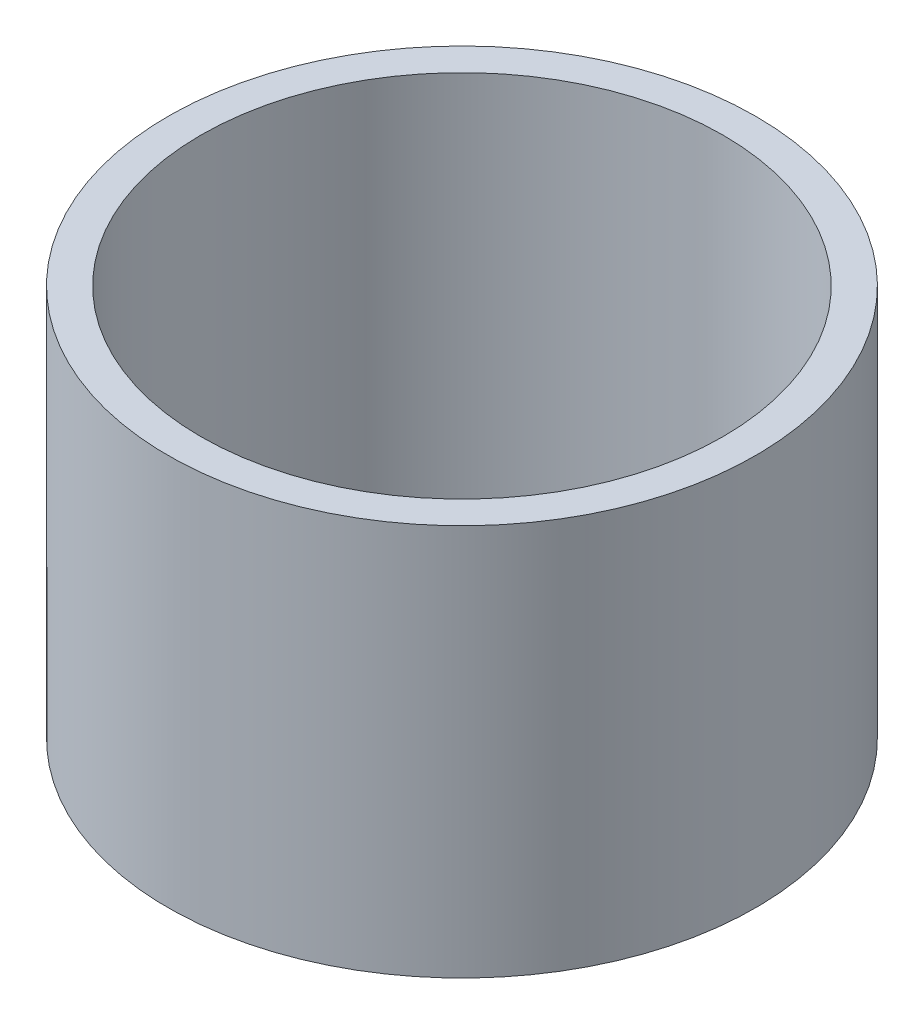
ISO-10303-21;
HEADER;
FILE_DESCRIPTION(('STEP AP214'),'2;1');
FILE_NAME('part.step','',(''),(''),'','','');
FILE_SCHEMA(('AUTOMOTIVE_DESIGN { 1 0 10303 214 1 1 1 1 }'));
ENDSEC;
DATA;
#1=APPLICATION_CONTEXT('core data for automotive mechanical design processes');
#2=APPLICATION_PROTOCOL_DEFINITION('international standard','automotive_design',2000,#1);
#3=PRODUCT_CONTEXT('',#1,'mechanical');
#4=PRODUCT('Part','Part','',(#3));
#5=PRODUCT_RELATED_PRODUCT_CATEGORY('part','',(#4));
#6=PRODUCT_DEFINITION_FORMATION('','',#4);
#7=PRODUCT_DEFINITION_CONTEXT('part definition',#1,'design');
#8=PRODUCT_DEFINITION('design','',#6,#7);
#9=PRODUCT_DEFINITION_SHAPE('','',#8);
#10=(LENGTH_UNIT() NAMED_UNIT(*) SI_UNIT(.MILLI.,.METRE.));
#11=(NAMED_UNIT(*) PLANE_ANGLE_UNIT() SI_UNIT($,.RADIAN.));
#12=(NAMED_UNIT(*) SI_UNIT($,.STERADIAN.) SOLID_ANGLE_UNIT());
#13=UNCERTAINTY_MEASURE_WITH_UNIT(LENGTH_MEASURE(1.E-05),#10,'distance_accuracy_value','');
#14=(GEOMETRIC_REPRESENTATION_CONTEXT(3) GLOBAL_UNCERTAINTY_ASSIGNED_CONTEXT((#13)) GLOBAL_UNIT_ASSIGNED_CONTEXT((#10,
#11,#12)) REPRESENTATION_CONTEXT('',''));
#15=CARTESIAN_POINT('',(0.,0.,0.));
#16=DIRECTION('',(0.,0.,1.));
#17=DIRECTION('',(1.,0.,0.));
#18=AXIS2_PLACEMENT_3D('',#15,#16,#17);
#19=CARTESIAN_POINT('',(0.,19.05,0.));
#20=DIRECTION('',(0.,1.,0.));
#21=DIRECTION('',(0.,0.,1.));
#22=AXIS2_PLACEMENT_3D('',#19,#20,#21);
#23=PLANE('',#22);
#24=CARTESIAN_POINT('',(0.,19.05,0.));
#25=DIRECTION('',(0.,1.,0.));
#26=DIRECTION('',(0.,0.,1.));
#27=AXIS2_PLACEMENT_3D('',#24,#25,#26);
#28=CIRCLE('',#27,14.2875);
#29=CARTESIAN_POINT('',(0.,19.05,-14.2875));
#30=VERTEX_POINT('',#29);
#31=EDGE_CURVE('E10',#30,#30,#28,.T.);
#32=ORIENTED_EDGE('',*,*,#31,.T.);
#33=EDGE_LOOP('',(#32));
#34=FACE_BOUND('',#33,.T.);
#35=CARTESIAN_POINT('',(0.,19.05,0.));
#36=DIRECTION('',(0.,1.,0.));
#37=DIRECTION('',(0.,0.,1.));
#38=AXIS2_PLACEMENT_3D('',#35,#36,#37);
#39=CIRCLE('',#38,12.7);
#40=CARTESIAN_POINT('',(0.,19.05,-12.7));
#41=VERTEX_POINT('',#40);
#42=EDGE_CURVE('E56',#41,#41,#39,.T.);
#43=ORIENTED_EDGE('',*,*,#42,.F.);
#44=EDGE_LOOP('',(#43));
#45=FACE_BOUND('',#44,.T.);
#46=ADVANCED_FACE('F43',(#34,#45),#23,.T.);
#47=CARTESIAN_POINT('',(0.,0.,0.));
#48=DIRECTION('',(0.,1.,0.));
#49=DIRECTION('',(0.,0.,1.));
#50=AXIS2_PLACEMENT_3D('',#47,#48,#49);
#51=PLANE('',#50);
#52=CARTESIAN_POINT('',(0.,0.,0.));
#53=DIRECTION('',(0.,1.,0.));
#54=DIRECTION('',(0.,0.,1.));
#55=AXIS2_PLACEMENT_3D('',#52,#53,#54);
#56=CIRCLE('',#55,14.2875);
#57=CARTESIAN_POINT('',(0.,0.,-14.2875));
#58=VERTEX_POINT('',#57);
#59=EDGE_CURVE('E47',#58,#58,#56,.T.);
#60=ORIENTED_EDGE('',*,*,#59,.F.);
#61=EDGE_LOOP('',(#60));
#62=FACE_BOUND('',#61,.T.);
#63=CARTESIAN_POINT('',(0.,0.,0.));
#64=DIRECTION('',(0.,1.,0.));
#65=DIRECTION('',(0.,0.,1.));
#66=AXIS2_PLACEMENT_3D('',#63,#64,#65);
#67=CIRCLE('',#66,12.7);
#68=CARTESIAN_POINT('',(0.,0.,-12.7));
#69=VERTEX_POINT('',#68);
#70=EDGE_CURVE('E58',#69,#69,#67,.T.);
#71=ORIENTED_EDGE('',*,*,#70,.T.);
#72=EDGE_LOOP('',(#71));
#73=FACE_BOUND('',#72,.T.);
#74=ADVANCED_FACE('F70',(#62,#73),#51,.F.);
#75=CARTESIAN_POINT('',(0.,19.05,0.));
#76=DIRECTION('',(0.,-1.,0.));
#77=DIRECTION('',(0.,0.,-1.));
#78=AXIS2_PLACEMENT_3D('',#75,#76,#77);
#79=CYLINDRICAL_SURFACE('',#78,14.2875);
#80=CARTESIAN_POINT('',(0.,19.05,-14.2875));
#81=CARTESIAN_POINT('',(0.,18.8515625,-14.2875));
#82=CARTESIAN_POINT('',(0.,18.653125,-14.2875));
#83=CARTESIAN_POINT('',(0.,18.25625,-14.2875));
#84=CARTESIAN_POINT('',(0.,18.0578125,-14.2875));
#85=CARTESIAN_POINT('',(0.,17.6609375,-14.2875));
#86=CARTESIAN_POINT('',(0.,17.4625,-14.2875));
#87=CARTESIAN_POINT('',(0.,17.065625,-14.2875));
#88=CARTESIAN_POINT('',(0.,16.8671875,-14.2875));
#89=CARTESIAN_POINT('',(0.,16.4703125,-14.2875));
#90=CARTESIAN_POINT('',(0.,16.271875,-14.2875));
#91=CARTESIAN_POINT('',(0.,15.875,-14.2875));
#92=CARTESIAN_POINT('',(0.,15.6765625,-14.2875));
#93=CARTESIAN_POINT('',(0.,15.2796875,-14.2875));
#94=CARTESIAN_POINT('',(0.,15.08125,-14.2875));
#95=CARTESIAN_POINT('',(0.,14.684375,-14.2875));
#96=CARTESIAN_POINT('',(0.,14.4859375,-14.2875));
#97=CARTESIAN_POINT('',(0.,14.0890625,-14.2875));
#98=CARTESIAN_POINT('',(0.,13.890625,-14.2875));
#99=CARTESIAN_POINT('',(0.,13.49375,-14.2875));
#100=CARTESIAN_POINT('',(0.,13.2953125,-14.2875));
#101=CARTESIAN_POINT('',(0.,12.8984375,-14.2875));
#102=CARTESIAN_POINT('',(0.,12.7,-14.2875));
#103=CARTESIAN_POINT('',(0.,12.303125,-14.2875));
#104=CARTESIAN_POINT('',(0.,12.1046875,-14.2875));
#105=CARTESIAN_POINT('',(0.,11.7078125,-14.2875));
#106=CARTESIAN_POINT('',(0.,11.509375,-14.2875));
#107=CARTESIAN_POINT('',(0.,11.1125,-14.2875));
#108=CARTESIAN_POINT('',(0.,10.9140625,-14.2875));
#109=CARTESIAN_POINT('',(0.,10.5171875,-14.2875));
#110=CARTESIAN_POINT('',(0.,10.31875,-14.2875));
#111=CARTESIAN_POINT('',(0.,9.921875,-14.2875));
#112=CARTESIAN_POINT('',(0.,9.7234375,-14.2875));
#113=CARTESIAN_POINT('',(0.,9.3265625,-14.2875));
#114=CARTESIAN_POINT('',(0.,9.128125,-14.2875));
#115=CARTESIAN_POINT('',(0.,8.73125,-14.2875));
#116=CARTESIAN_POINT('',(0.,8.5328125,-14.2875));
#117=CARTESIAN_POINT('',(0.,8.1359375,-14.2875));
#118=CARTESIAN_POINT('',(0.,7.9375,-14.2875));
#119=CARTESIAN_POINT('',(0.,7.540625,-14.2875));
#120=CARTESIAN_POINT('',(0.,7.3421875,-14.2875));
#121=CARTESIAN_POINT('',(0.,6.9453125,-14.2875));
#122=CARTESIAN_POINT('',(0.,6.746875,-14.2875));
#123=CARTESIAN_POINT('',(0.,6.35,-14.2875));
#124=CARTESIAN_POINT('',(0.,6.1515625,-14.2875));
#125=CARTESIAN_POINT('',(0.,5.7546875,-14.2875));
#126=CARTESIAN_POINT('',(0.,5.55625,-14.2875));
#127=CARTESIAN_POINT('',(0.,5.159375,-14.2875));
#128=CARTESIAN_POINT('',(0.,4.9609375,-14.2875));
#129=CARTESIAN_POINT('',(0.,4.5640625,-14.2875));
#130=CARTESIAN_POINT('',(0.,4.365625,-14.2875));
#131=CARTESIAN_POINT('',(0.,3.96875,-14.2875));
#132=CARTESIAN_POINT('',(0.,3.7703125,-14.2875));
#133=CARTESIAN_POINT('',(0.,3.3734375,-14.2875));
#134=CARTESIAN_POINT('',(0.,3.175,-14.2875));
#135=CARTESIAN_POINT('',(0.,2.778125,-14.2875));
#136=CARTESIAN_POINT('',(0.,2.5796875,-14.2875));
#137=CARTESIAN_POINT('',(0.,2.1828125,-14.2875));
#138=CARTESIAN_POINT('',(0.,1.984375,-14.2875));
#139=CARTESIAN_POINT('',(0.,1.5875,-14.2875));
#140=CARTESIAN_POINT('',(0.,1.3890625,-14.2875));
#141=CARTESIAN_POINT('',(0.,0.992187500000001,-14.2875));
#142=CARTESIAN_POINT('',(0.,0.793750000000001,-14.2875));
#143=CARTESIAN_POINT('',(0.,0.396875,-14.2875));
#144=CARTESIAN_POINT('',(0.,0.1984375,-14.2875));
#145=CARTESIAN_POINT('',(0.,0.,-14.2875));
#146=B_SPLINE_CURVE_WITH_KNOTS('',3,(#80,#81,#82,#83,#84,#85,#86,#87,#88,#89,#90,#91,#92,#93,
#94,#95,#96,#97,#98,#99,#100,#101,#102,#103,#104,#105,#106,#107,#108,#109,#110,#111,#112,#113,
#114,#115,#116,#117,#118,#119,#120,#121,#122,#123,#124,#125,#126,#127,#128,#129,#130,#131,#132,
#133,#134,#135,#136,#137,#138,#139,#140,#141,#142,#143,#144,#145),.UNSPECIFIED.,.F.,.F.,(4,2,2,
2,2,2,2,2,2,2,2,2,2,2,2,2,2,2,2,2,2,2,2,2,2,2,2,2,2,2,2,2,4),(0.,0.5953125,1.190625,1.7859375,
2.38125,2.9765625,3.571875,4.1671875,4.7625,5.3578125,5.953125,6.5484375,7.14375,7.7390625,
8.334375,8.9296875,9.525,10.1203125,10.715625,11.3109375,11.90625,12.5015625,13.096875,
13.6921875,14.2875,14.8828125,15.478125,16.0734375,16.66875,17.2640625,17.859375,18.4546875,
19.05),.UNSPECIFIED.);
#147=EDGE_CURVE('BSEAM45',#30,#58,#146,.T.);
#148=ORIENTED_EDGE('',*,*,#31,.F.);
#149=ORIENTED_EDGE('',*,*,#59,.T.);
#150=ORIENTED_EDGE('',*,*,#147,.T.);
#151=ORIENTED_EDGE('',*,*,#147,.F.);
#152=EDGE_LOOP('',(#148,#150,#149,#151));
#153=FACE_BOUND('',#152,.T.);
#154=ADVANCED_FACE('F45',(#153),#79,.T.);
#155=CARTESIAN_POINT('',(0.,19.05,0.));
#156=DIRECTION('',(0.,-1.,0.));
#157=DIRECTION('',(0.,0.,-1.));
#158=AXIS2_PLACEMENT_3D('',#155,#156,#157);
#159=CYLINDRICAL_SURFACE('',#158,12.7);
#160=CARTESIAN_POINT('',(0.,19.05,-12.7));
#161=CARTESIAN_POINT('',(0.,18.8515625,-12.7));
#162=CARTESIAN_POINT('',(0.,18.653125,-12.7));
#163=CARTESIAN_POINT('',(0.,18.25625,-12.7));
#164=CARTESIAN_POINT('',(0.,18.0578125,-12.7));
#165=CARTESIAN_POINT('',(0.,17.6609375,-12.7));
#166=CARTESIAN_POINT('',(0.,17.4625,-12.7));
#167=CARTESIAN_POINT('',(0.,17.065625,-12.7));
#168=CARTESIAN_POINT('',(0.,16.8671875,-12.7));
#169=CARTESIAN_POINT('',(0.,16.4703125,-12.7));
#170=CARTESIAN_POINT('',(0.,16.271875,-12.7));
#171=CARTESIAN_POINT('',(0.,15.875,-12.7));
#172=CARTESIAN_POINT('',(0.,15.6765625,-12.7));
#173=CARTESIAN_POINT('',(0.,15.2796875,-12.7));
#174=CARTESIAN_POINT('',(0.,15.08125,-12.7));
#175=CARTESIAN_POINT('',(0.,14.684375,-12.7));
#176=CARTESIAN_POINT('',(0.,14.4859375,-12.7));
#177=CARTESIAN_POINT('',(0.,14.0890625,-12.7));
#178=CARTESIAN_POINT('',(0.,13.890625,-12.7));
#179=CARTESIAN_POINT('',(0.,13.49375,-12.7));
#180=CARTESIAN_POINT('',(0.,13.2953125,-12.7));
#181=CARTESIAN_POINT('',(0.,12.8984375,-12.7));
#182=CARTESIAN_POINT('',(0.,12.7,-12.7));
#183=CARTESIAN_POINT('',(0.,12.303125,-12.7));
#184=CARTESIAN_POINT('',(0.,12.1046875,-12.7));
#185=CARTESIAN_POINT('',(0.,11.7078125,-12.7));
#186=CARTESIAN_POINT('',(0.,11.509375,-12.7));
#187=CARTESIAN_POINT('',(0.,11.1125,-12.7));
#188=CARTESIAN_POINT('',(0.,10.9140625,-12.7));
#189=CARTESIAN_POINT('',(0.,10.5171875,-12.7));
#190=CARTESIAN_POINT('',(0.,10.31875,-12.7));
#191=CARTESIAN_POINT('',(0.,9.921875,-12.7));
#192=CARTESIAN_POINT('',(0.,9.7234375,-12.7));
#193=CARTESIAN_POINT('',(0.,9.3265625,-12.7));
#194=CARTESIAN_POINT('',(0.,9.128125,-12.7));
#195=CARTESIAN_POINT('',(0.,8.73125,-12.7));
#196=CARTESIAN_POINT('',(0.,8.5328125,-12.7));
#197=CARTESIAN_POINT('',(0.,8.1359375,-12.7));
#198=CARTESIAN_POINT('',(0.,7.9375,-12.7));
#199=CARTESIAN_POINT('',(0.,7.540625,-12.7));
#200=CARTESIAN_POINT('',(0.,7.3421875,-12.7));
#201=CARTESIAN_POINT('',(0.,6.9453125,-12.7));
#202=CARTESIAN_POINT('',(0.,6.746875,-12.7));
#203=CARTESIAN_POINT('',(0.,6.35,-12.7));
#204=CARTESIAN_POINT('',(0.,6.1515625,-12.7));
#205=CARTESIAN_POINT('',(0.,5.7546875,-12.7));
#206=CARTESIAN_POINT('',(0.,5.55625,-12.7));
#207=CARTESIAN_POINT('',(0.,5.159375,-12.7));
#208=CARTESIAN_POINT('',(0.,4.9609375,-12.7));
#209=CARTESIAN_POINT('',(0.,4.5640625,-12.7));
#210=CARTESIAN_POINT('',(0.,4.365625,-12.7));
#211=CARTESIAN_POINT('',(0.,3.96875,-12.7));
#212=CARTESIAN_POINT('',(0.,3.7703125,-12.7));
#213=CARTESIAN_POINT('',(0.,3.3734375,-12.7));
#214=CARTESIAN_POINT('',(0.,3.175,-12.7));
#215=CARTESIAN_POINT('',(0.,2.778125,-12.7));
#216=CARTESIAN_POINT('',(0.,2.5796875,-12.7));
#217=CARTESIAN_POINT('',(0.,2.1828125,-12.7));
#218=CARTESIAN_POINT('',(0.,1.984375,-12.7));
#219=CARTESIAN_POINT('',(0.,1.5875,-12.7));
#220=CARTESIAN_POINT('',(0.,1.3890625,-12.7));
#221=CARTESIAN_POINT('',(0.,0.992187500000001,-12.7));
#222=CARTESIAN_POINT('',(0.,0.793750000000001,-12.7));
#223=CARTESIAN_POINT('',(0.,0.396875,-12.7));
#224=CARTESIAN_POINT('',(0.,0.1984375,-12.7));
#225=CARTESIAN_POINT('',(0.,0.,-12.7));
#226=B_SPLINE_CURVE_WITH_KNOTS('',3,(#160,#161,#162,#163,#164,#165,#166,#167,#168,#169,#170,
#171,#172,#173,#174,#175,#176,#177,#178,#179,#180,#181,#182,#183,#184,#185,#186,#187,#188,#189,
#190,#191,#192,#193,#194,#195,#196,#197,#198,#199,#200,#201,#202,#203,#204,#205,#206,#207,#208,
#209,#210,#211,#212,#213,#214,#215,#216,#217,#218,#219,#220,#221,#222,#223,#224,#225),
.UNSPECIFIED.,.F.,.F.,(4,2,2,2,2,2,2,2,2,2,2,2,2,2,2,2,2,2,2,2,2,2,2,2,2,2,2,2,2,2,2,2,4),(0.,
0.595312499999997,1.190625,1.7859375,2.38125,2.9765625,3.571875,4.1671875,4.7625,5.3578125,
5.953125,6.5484375,7.14375,7.7390625,8.334375,8.9296875,9.525,10.1203125,10.715625,11.3109375,
11.90625,12.5015625,13.096875,13.6921875,14.2875,14.8828125,15.478125,16.0734375,16.66875,
17.2640625,17.859375,18.4546875,19.05),.UNSPECIFIED.);
#227=EDGE_CURVE('BSEAM66',#41,#69,#226,.T.);
#228=ORIENTED_EDGE('',*,*,#42,.T.);
#229=ORIENTED_EDGE('',*,*,#70,.F.);
#230=ORIENTED_EDGE('',*,*,#227,.T.);
#231=ORIENTED_EDGE('',*,*,#227,.F.);
#232=EDGE_LOOP('',(#228,#230,#229,#231));
#233=FACE_BOUND('',#232,.T.);
#234=ADVANCED_FACE('F66',(#233),#159,.F.);
#235=CLOSED_SHELL('',(#46,#74,#154,#234));
#236=MANIFOLD_SOLID_BREP('B2',#235);
#237=ADVANCED_BREP_SHAPE_REPRESENTATION('',(#18,#236),#14);
#238=SHAPE_DEFINITION_REPRESENTATION(#9,#237);
ENDSEC;
END-ISO-10303-21;
